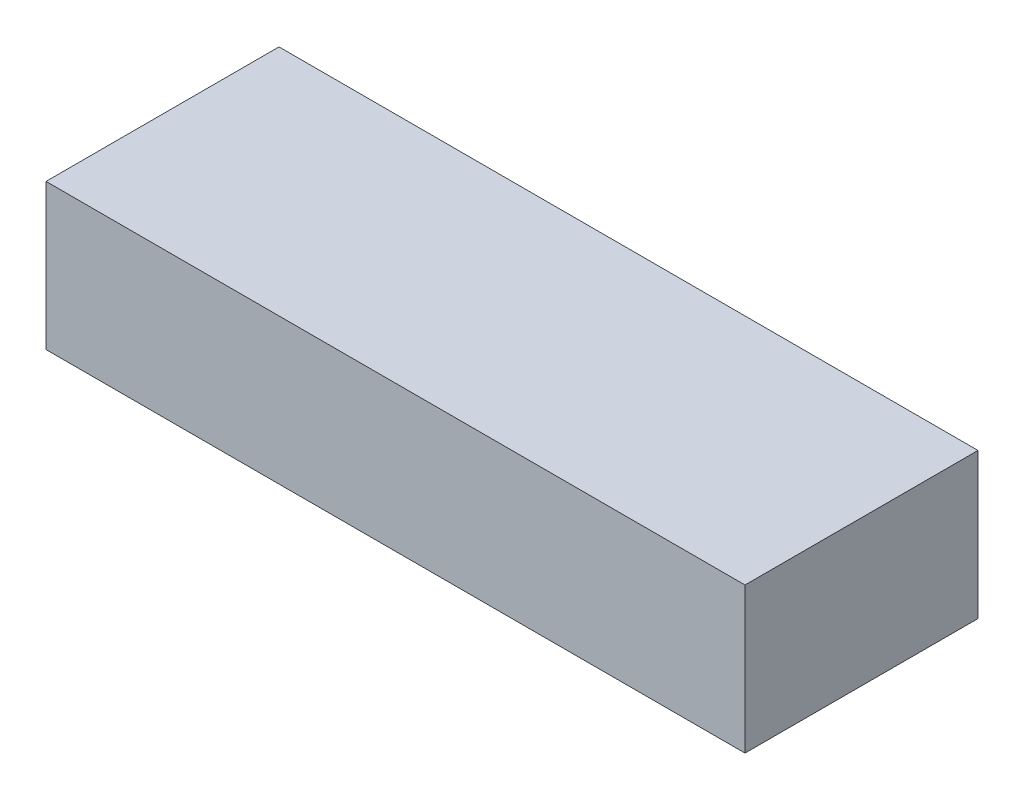
ISO-10303-21;
HEADER;
FILE_DESCRIPTION(('STEP AP214'),'2;1');
FILE_NAME('part.step','',(''),(''),'','','');
FILE_SCHEMA(('AUTOMOTIVE_DESIGN { 1 0 10303 214 1 1 1 1 }'));
ENDSEC;
DATA;
#1=APPLICATION_CONTEXT('core data for automotive mechanical design processes');
#2=APPLICATION_PROTOCOL_DEFINITION('international standard','automotive_design',2000,#1);
#3=PRODUCT_CONTEXT('',#1,'mechanical');
#4=PRODUCT('Part','Part','',(#3));
#5=PRODUCT_RELATED_PRODUCT_CATEGORY('part','',(#4));
#6=PRODUCT_DEFINITION_FORMATION('','',#4);
#7=PRODUCT_DEFINITION_CONTEXT('part definition',#1,'design');
#8=PRODUCT_DEFINITION('design','',#6,#7);
#9=PRODUCT_DEFINITION_SHAPE('','',#8);
#10=(LENGTH_UNIT() NAMED_UNIT(*) SI_UNIT(.MILLI.,.METRE.));
#11=(NAMED_UNIT(*) PLANE_ANGLE_UNIT() SI_UNIT($,.RADIAN.));
#12=(NAMED_UNIT(*) SI_UNIT($,.STERADIAN.) SOLID_ANGLE_UNIT());
#13=UNCERTAINTY_MEASURE_WITH_UNIT(LENGTH_MEASURE(1.E-05),#10,'distance_accuracy_value','');
#14=(GEOMETRIC_REPRESENTATION_CONTEXT(3) GLOBAL_UNCERTAINTY_ASSIGNED_CONTEXT((#13)) GLOBAL_UNIT_ASSIGNED_CONTEXT((#10,
#11,#12)) REPRESENTATION_CONTEXT('',''));
#15=CARTESIAN_POINT('',(0.,0.,0.));
#16=DIRECTION('',(0.,0.,1.));
#17=DIRECTION('',(1.,0.,0.));
#18=AXIS2_PLACEMENT_3D('',#15,#16,#17);
#19=CARTESIAN_POINT('',(60.,25.,20.));
#20=DIRECTION('',(-1.,0.,0.));
#21=DIRECTION('',(0.,0.,1.));
#22=AXIS2_PLACEMENT_3D('',#19,#20,#21);
#23=PLANE('',#22);
#24=DIRECTION('',(0.,0.,-1.));
#25=VECTOR('',#24,1.);
#26=CARTESIAN_POINT('',(60.,0.,20.));
#27=LINE('',#26,#25);
#28=CARTESIAN_POINT('',(60.,0.,20.));
#29=VERTEX_POINT('',#28);
#30=CARTESIAN_POINT('',(60.,0.,-20.));
#31=VERTEX_POINT('',#30);
#32=EDGE_CURVE('E101',#29,#31,#27,.T.);
#33=ORIENTED_EDGE('',*,*,#32,.T.);
#34=DIRECTION('',(0.,-1.,0.));
#35=VECTOR('',#34,1.);
#36=CARTESIAN_POINT('',(60.,25.,-20.));
#37=LINE('',#36,#35);
#38=CARTESIAN_POINT('',(60.,25.,-20.));
#39=VERTEX_POINT('',#38);
#40=EDGE_CURVE('E11',#39,#31,#37,.T.);
#41=ORIENTED_EDGE('',*,*,#40,.F.);
#42=DIRECTION('',(0.,0.,-1.));
#43=VECTOR('',#42,1.);
#44=CARTESIAN_POINT('',(60.,25.,20.));
#45=LINE('',#44,#43);
#46=CARTESIAN_POINT('',(60.,25.,20.));
#47=VERTEX_POINT('',#46);
#48=EDGE_CURVE('E89',#47,#39,#45,.T.);
#49=ORIENTED_EDGE('',*,*,#48,.F.);
#50=DIRECTION('',(0.,-1.,0.));
#51=VECTOR('',#50,1.);
#52=CARTESIAN_POINT('',(60.,25.,20.));
#53=LINE('',#52,#51);
#54=EDGE_CURVE('E97',#47,#29,#53,.T.);
#55=ORIENTED_EDGE('',*,*,#54,.T.);
#56=EDGE_LOOP('',(#33,#41,#49,#55));
#57=FACE_BOUND('',#56,.T.);
#58=ADVANCED_FACE('F38',(#57),#23,.F.);
#59=CARTESIAN_POINT('',(-60.,25.,-20.));
#60=DIRECTION('',(0.,0.,1.));
#61=DIRECTION('',(1.,0.,0.));
#62=AXIS2_PLACEMENT_3D('',#59,#60,#61);
#63=PLANE('',#62);
#64=DIRECTION('',(-1.,0.,0.));
#65=VECTOR('',#64,1.);
#66=CARTESIAN_POINT('',(-60.,0.,-20.));
#67=LINE('',#66,#65);
#68=CARTESIAN_POINT('',(-60.,0.,-20.));
#69=VERTEX_POINT('',#68);
#70=EDGE_CURVE('E93',#31,#69,#67,.T.);
#71=ORIENTED_EDGE('',*,*,#70,.T.);
#72=DIRECTION('',(0.,-1.,0.));
#73=VECTOR('',#72,1.);
#74=CARTESIAN_POINT('',(-60.,25.,-20.));
#75=LINE('',#74,#73);
#76=CARTESIAN_POINT('',(-60.,25.,-20.));
#77=VERTEX_POINT('',#76);
#78=EDGE_CURVE('E46',#77,#69,#75,.T.);
#79=ORIENTED_EDGE('',*,*,#78,.F.);
#80=DIRECTION('',(-1.,0.,0.));
#81=VECTOR('',#80,1.);
#82=CARTESIAN_POINT('',(-60.,25.,-20.));
#83=LINE('',#82,#81);
#84=EDGE_CURVE('E84',#39,#77,#83,.T.);
#85=ORIENTED_EDGE('',*,*,#84,.F.);
#86=ORIENTED_EDGE('',*,*,#40,.T.);
#87=EDGE_LOOP('',(#71,#79,#85,#86));
#88=FACE_BOUND('',#87,.T.);
#89=ADVANCED_FACE('F92',(#88),#63,.F.);
#90=CARTESIAN_POINT('',(-60.,25.,20.));
#91=DIRECTION('',(1.,0.,0.));
#92=DIRECTION('',(0.,0.,-1.));
#93=AXIS2_PLACEMENT_3D('',#90,#91,#92);
#94=PLANE('',#93);
#95=DIRECTION('',(0.,0.,1.));
#96=VECTOR('',#95,1.);
#97=CARTESIAN_POINT('',(-60.,0.,20.));
#98=LINE('',#97,#96);
#99=CARTESIAN_POINT('',(-60.,0.,20.));
#100=VERTEX_POINT('',#99);
#101=EDGE_CURVE('E71',#69,#100,#98,.T.);
#102=ORIENTED_EDGE('',*,*,#101,.T.);
#103=DIRECTION('',(0.,-1.,0.));
#104=VECTOR('',#103,1.);
#105=CARTESIAN_POINT('',(-60.,25.,20.));
#106=LINE('',#105,#104);
#107=CARTESIAN_POINT('',(-60.,25.,20.));
#108=VERTEX_POINT('',#107);
#109=EDGE_CURVE('E94',#108,#100,#106,.T.);
#110=ORIENTED_EDGE('',*,*,#109,.F.);
#111=DIRECTION('',(0.,0.,1.));
#112=VECTOR('',#111,1.);
#113=CARTESIAN_POINT('',(-60.,25.,20.));
#114=LINE('',#113,#112);
#115=EDGE_CURVE('E87',#77,#108,#114,.T.);
#116=ORIENTED_EDGE('',*,*,#115,.F.);
#117=ORIENTED_EDGE('',*,*,#78,.T.);
#118=EDGE_LOOP('',(#102,#110,#116,#117));
#119=FACE_BOUND('',#118,.T.);
#120=ADVANCED_FACE('F95',(#119),#94,.F.);
#121=CARTESIAN_POINT('',(-60.,25.,20.));
#122=DIRECTION('',(0.,0.,-1.));
#123=DIRECTION('',(-1.,0.,0.));
#124=AXIS2_PLACEMENT_3D('',#121,#122,#123);
#125=PLANE('',#124);
#126=DIRECTION('',(1.,0.,0.));
#127=VECTOR('',#126,1.);
#128=CARTESIAN_POINT('',(-60.,0.,20.));
#129=LINE('',#128,#127);
#130=EDGE_CURVE('E77',#100,#29,#129,.T.);
#131=ORIENTED_EDGE('',*,*,#130,.T.);
#132=ORIENTED_EDGE('',*,*,#54,.F.);
#133=DIRECTION('',(1.,0.,0.));
#134=VECTOR('',#133,1.);
#135=CARTESIAN_POINT('',(-60.,25.,20.));
#136=LINE('',#135,#134);
#137=EDGE_CURVE('E54',#108,#47,#136,.T.);
#138=ORIENTED_EDGE('',*,*,#137,.F.);
#139=ORIENTED_EDGE('',*,*,#109,.T.);
#140=EDGE_LOOP('',(#131,#132,#138,#139));
#141=FACE_BOUND('',#140,.T.);
#142=ADVANCED_FACE('F108',(#141),#125,.F.);
#143=CARTESIAN_POINT('',(0.,25.,0.));
#144=DIRECTION('',(0.,-1.,0.));
#145=DIRECTION('',(0.,0.,-1.));
#146=AXIS2_PLACEMENT_3D('',#143,#144,#145);
#147=PLANE('',#146);
#148=ORIENTED_EDGE('',*,*,#48,.T.);
#149=ORIENTED_EDGE('',*,*,#84,.T.);
#150=ORIENTED_EDGE('',*,*,#115,.T.);
#151=ORIENTED_EDGE('',*,*,#137,.T.);
#152=EDGE_LOOP('',(#148,#149,#150,#151));
#153=FACE_BOUND('',#152,.T.);
#154=ADVANCED_FACE('F85',(#153),#147,.F.);
#155=CARTESIAN_POINT('',(0.,0.,0.));
#156=DIRECTION('',(0.,-1.,0.));
#157=DIRECTION('',(0.,0.,-1.));
#158=AXIS2_PLACEMENT_3D('',#155,#156,#157);
#159=PLANE('',#158);
#160=ORIENTED_EDGE('',*,*,#32,.F.);
#161=ORIENTED_EDGE('',*,*,#130,.F.);
#162=ORIENTED_EDGE('',*,*,#101,.F.);
#163=ORIENTED_EDGE('',*,*,#70,.F.);
#164=EDGE_LOOP('',(#160,#161,#162,#163));
#165=FACE_BOUND('',#164,.T.);
#166=ADVANCED_FACE('F111',(#165),#159,.T.);
#167=CLOSED_SHELL('',(#58,#89,#120,#142,#154,#166));
#168=MANIFOLD_SOLID_BREP('B2',#167);
#169=ADVANCED_BREP_SHAPE_REPRESENTATION('',(#18,#168),#14);
#170=SHAPE_DEFINITION_REPRESENTATION(#9,#169);
ENDSEC;
END-ISO-10303-21;
